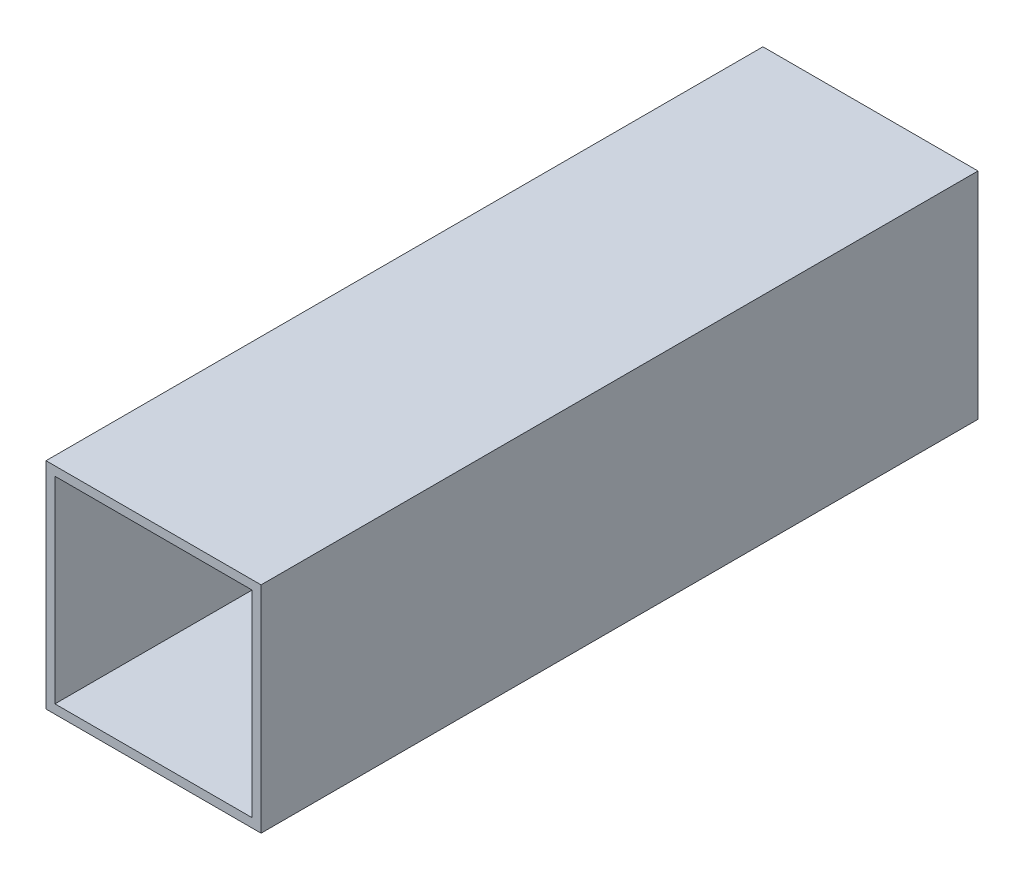
ISO-10303-21;
HEADER;
FILE_DESCRIPTION(('STEP AP214'),'2;1');
FILE_NAME('part.step','',(''),(''),'','','');
FILE_SCHEMA(('AUTOMOTIVE_DESIGN { 1 0 10303 214 1 1 1 1 }'));
ENDSEC;
DATA;
#1=APPLICATION_CONTEXT('core data for automotive mechanical design processes');
#2=APPLICATION_PROTOCOL_DEFINITION('international standard','automotive_design',2000,#1);
#3=PRODUCT_CONTEXT('',#1,'mechanical');
#4=PRODUCT('Part','Part','',(#3));
#5=PRODUCT_RELATED_PRODUCT_CATEGORY('part','',(#4));
#6=PRODUCT_DEFINITION_FORMATION('','',#4);
#7=PRODUCT_DEFINITION_CONTEXT('part definition',#1,'design');
#8=PRODUCT_DEFINITION('design','',#6,#7);
#9=PRODUCT_DEFINITION_SHAPE('','',#8);
#10=(LENGTH_UNIT() NAMED_UNIT(*) SI_UNIT(.MILLI.,.METRE.));
#11=(NAMED_UNIT(*) PLANE_ANGLE_UNIT() SI_UNIT($,.RADIAN.));
#12=(NAMED_UNIT(*) SI_UNIT($,.STERADIAN.) SOLID_ANGLE_UNIT());
#13=UNCERTAINTY_MEASURE_WITH_UNIT(LENGTH_MEASURE(1.E-05),#10,'distance_accuracy_value','');
#14=(GEOMETRIC_REPRESENTATION_CONTEXT(3) GLOBAL_UNCERTAINTY_ASSIGNED_CONTEXT((#13)) GLOBAL_UNIT_ASSIGNED_CONTEXT((#10,
#11,#12)) REPRESENTATION_CONTEXT('',''));
#15=CARTESIAN_POINT('',(0.,0.,0.));
#16=DIRECTION('',(0.,0.,1.));
#17=DIRECTION('',(1.,0.,0.));
#18=AXIS2_PLACEMENT_3D('',#15,#16,#17);
#19=CARTESIAN_POINT('',(0.,0.,127.));
#20=DIRECTION('',(0.,0.,-1.));
#21=DIRECTION('',(-1.,0.,0.));
#22=AXIS2_PLACEMENT_3D('',#19,#20,#21);
#23=PLANE('',#22);
#24=DIRECTION('',(0.,-1.,0.));
#25=VECTOR('',#24,1.);
#26=CARTESIAN_POINT('',(0.,0.,127.));
#27=LINE('',#26,#25);
#28=CARTESIAN_POINT('',(0.,38.1,127.));
#29=VERTEX_POINT('',#28);
#30=CARTESIAN_POINT('',(0.,0.,127.));
#31=VERTEX_POINT('',#30);
#32=EDGE_CURVE('E134',#29,#31,#27,.T.);
#33=ORIENTED_EDGE('',*,*,#32,.T.);
#34=DIRECTION('',(1.,0.,0.));
#35=VECTOR('',#34,1.);
#36=CARTESIAN_POINT('',(0.,0.,127.));
#37=LINE('',#36,#35);
#38=CARTESIAN_POINT('',(38.1,0.,127.));
#39=VERTEX_POINT('',#38);
#40=EDGE_CURVE('E137',#31,#39,#37,.T.);
#41=ORIENTED_EDGE('',*,*,#40,.T.);
#42=DIRECTION('',(0.,1.,0.));
#43=VECTOR('',#42,1.);
#44=CARTESIAN_POINT('',(38.1,0.,127.));
#45=LINE('',#44,#43);
#46=CARTESIAN_POINT('',(38.1,38.1,127.));
#47=VERTEX_POINT('',#46);
#48=EDGE_CURVE('E140',#39,#47,#45,.T.);
#49=ORIENTED_EDGE('',*,*,#48,.T.);
#50=DIRECTION('',(-1.,0.,0.));
#51=VECTOR('',#50,1.);
#52=CARTESIAN_POINT('',(0.,38.1,127.));
#53=LINE('',#52,#51);
#54=EDGE_CURVE('E142',#47,#29,#53,.T.);
#55=ORIENTED_EDGE('',*,*,#54,.T.);
#56=EDGE_LOOP('',(#33,#41,#49,#55));
#57=FACE_BOUND('',#56,.T.);
#58=DIRECTION('',(0.,-1.,0.));
#59=VECTOR('',#58,1.);
#60=CARTESIAN_POINT('',(1.5875,1.5875,127.));
#61=LINE('',#60,#59);
#62=CARTESIAN_POINT('',(1.5875,36.5125,127.));
#63=VERTEX_POINT('',#62);
#64=CARTESIAN_POINT('',(1.5875,1.5875,127.));
#65=VERTEX_POINT('',#64);
#66=EDGE_CURVE('E98',#63,#65,#61,.T.);
#67=ORIENTED_EDGE('',*,*,#66,.F.);
#68=DIRECTION('',(-1.,0.,0.));
#69=VECTOR('',#68,1.);
#70=CARTESIAN_POINT('',(1.5875,36.5125,127.));
#71=LINE('',#70,#69);
#72=CARTESIAN_POINT('',(36.5125,36.5125,127.));
#73=VERTEX_POINT('',#72);
#74=EDGE_CURVE('E120',#73,#63,#71,.T.);
#75=ORIENTED_EDGE('',*,*,#74,.F.);
#76=DIRECTION('',(0.,1.,0.));
#77=VECTOR('',#76,1.);
#78=CARTESIAN_POINT('',(36.5125,1.5875,127.));
#79=LINE('',#78,#77);
#80=CARTESIAN_POINT('',(36.5125,1.5875,127.));
#81=VERTEX_POINT('',#80);
#82=EDGE_CURVE('E118',#81,#73,#79,.T.);
#83=ORIENTED_EDGE('',*,*,#82,.F.);
#84=DIRECTION('',(1.,0.,0.));
#85=VECTOR('',#84,1.);
#86=CARTESIAN_POINT('',(1.5875,1.5875,127.));
#87=LINE('',#86,#85);
#88=EDGE_CURVE('E106',#65,#81,#87,.T.);
#89=ORIENTED_EDGE('',*,*,#88,.F.);
#90=EDGE_LOOP('',(#67,#75,#83,#89));
#91=FACE_BOUND('',#90,.T.);
#92=ADVANCED_FACE('F33',(#57,#91),#23,.F.);
#93=CARTESIAN_POINT('',(0.,0.,0.));
#94=DIRECTION('',(0.,0.,-1.));
#95=DIRECTION('',(-1.,0.,0.));
#96=AXIS2_PLACEMENT_3D('',#93,#94,#95);
#97=PLANE('',#96);
#98=DIRECTION('',(0.,-1.,0.));
#99=VECTOR('',#98,1.);
#100=CARTESIAN_POINT('',(0.,0.,0.));
#101=LINE('',#100,#99);
#102=CARTESIAN_POINT('',(0.,38.1,0.));
#103=VERTEX_POINT('',#102);
#104=CARTESIAN_POINT('',(0.,0.,0.));
#105=VERTEX_POINT('',#104);
#106=EDGE_CURVE('E114',#103,#105,#101,.T.);
#107=ORIENTED_EDGE('',*,*,#106,.F.);
#108=DIRECTION('',(-1.,0.,0.));
#109=VECTOR('',#108,1.);
#110=CARTESIAN_POINT('',(0.,38.1,0.));
#111=LINE('',#110,#109);
#112=CARTESIAN_POINT('',(38.1,38.1,0.));
#113=VERTEX_POINT('',#112);
#114=EDGE_CURVE('E138',#113,#103,#111,.T.);
#115=ORIENTED_EDGE('',*,*,#114,.F.);
#116=DIRECTION('',(0.,1.,0.));
#117=VECTOR('',#116,1.);
#118=CARTESIAN_POINT('',(38.1,0.,0.));
#119=LINE('',#118,#117);
#120=CARTESIAN_POINT('',(38.1,0.,0.));
#121=VERTEX_POINT('',#120);
#122=EDGE_CURVE('E149',#121,#113,#119,.T.);
#123=ORIENTED_EDGE('',*,*,#122,.F.);
#124=DIRECTION('',(1.,0.,0.));
#125=VECTOR('',#124,1.);
#126=CARTESIAN_POINT('',(0.,0.,0.));
#127=LINE('',#126,#125);
#128=EDGE_CURVE('E147',#105,#121,#127,.T.);
#129=ORIENTED_EDGE('',*,*,#128,.F.);
#130=EDGE_LOOP('',(#107,#115,#123,#129));
#131=FACE_BOUND('',#130,.T.);
#132=DIRECTION('',(-1.,0.,0.));
#133=VECTOR('',#132,1.);
#134=CARTESIAN_POINT('',(1.5875,36.5125,0.));
#135=LINE('',#134,#133);
#136=CARTESIAN_POINT('',(36.5125,36.5125,0.));
#137=VERTEX_POINT('',#136);
#138=CARTESIAN_POINT('',(1.5875,36.5125,0.));
#139=VERTEX_POINT('',#138);
#140=EDGE_CURVE('E107',#137,#139,#135,.T.);
#141=ORIENTED_EDGE('',*,*,#140,.T.);
#142=DIRECTION('',(0.,-1.,0.));
#143=VECTOR('',#142,1.);
#144=CARTESIAN_POINT('',(1.5875,1.5875,0.));
#145=LINE('',#144,#143);
#146=CARTESIAN_POINT('',(1.5875,1.5875,0.));
#147=VERTEX_POINT('',#146);
#148=EDGE_CURVE('E56',#139,#147,#145,.T.);
#149=ORIENTED_EDGE('',*,*,#148,.T.);
#150=DIRECTION('',(1.,0.,0.));
#151=VECTOR('',#150,1.);
#152=CARTESIAN_POINT('',(1.5875,1.5875,0.));
#153=LINE('',#152,#151);
#154=CARTESIAN_POINT('',(36.5125,1.5875,0.));
#155=VERTEX_POINT('',#154);
#156=EDGE_CURVE('E113',#147,#155,#153,.T.);
#157=ORIENTED_EDGE('',*,*,#156,.T.);
#158=DIRECTION('',(0.,1.,0.));
#159=VECTOR('',#158,1.);
#160=CARTESIAN_POINT('',(36.5125,1.5875,0.));
#161=LINE('',#160,#159);
#162=EDGE_CURVE('E126',#155,#137,#161,.T.);
#163=ORIENTED_EDGE('',*,*,#162,.T.);
#164=EDGE_LOOP('',(#141,#149,#157,#163));
#165=FACE_BOUND('',#164,.T.);
#166=ADVANCED_FACE('F167',(#131,#165),#97,.T.);
#167=CARTESIAN_POINT('',(0.,0.,127.));
#168=DIRECTION('',(1.,0.,0.));
#169=DIRECTION('',(0.,0.,-1.));
#170=AXIS2_PLACEMENT_3D('',#167,#168,#169);
#171=PLANE('',#170);
#172=ORIENTED_EDGE('',*,*,#106,.T.);
#173=DIRECTION('',(0.,0.,-1.));
#174=VECTOR('',#173,1.);
#175=CARTESIAN_POINT('',(0.,0.,127.));
#176=LINE('',#175,#174);
#177=EDGE_CURVE('E11',#31,#105,#176,.T.);
#178=ORIENTED_EDGE('',*,*,#177,.F.);
#179=ORIENTED_EDGE('',*,*,#32,.F.);
#180=DIRECTION('',(0.,0.,-1.));
#181=VECTOR('',#180,1.);
#182=CARTESIAN_POINT('',(0.,38.1,127.));
#183=LINE('',#182,#181);
#184=EDGE_CURVE('E144',#29,#103,#183,.T.);
#185=ORIENTED_EDGE('',*,*,#184,.T.);
#186=EDGE_LOOP('',(#172,#178,#179,#185));
#187=FACE_BOUND('',#186,.T.);
#188=ADVANCED_FACE('F35',(#187),#171,.F.);
#189=CARTESIAN_POINT('',(0.,0.,127.));
#190=DIRECTION('',(0.,1.,0.));
#191=DIRECTION('',(0.,0.,1.));
#192=AXIS2_PLACEMENT_3D('',#189,#190,#191);
#193=PLANE('',#192);
#194=ORIENTED_EDGE('',*,*,#128,.T.);
#195=DIRECTION('',(0.,0.,-1.));
#196=VECTOR('',#195,1.);
#197=CARTESIAN_POINT('',(38.1,0.,127.));
#198=LINE('',#197,#196);
#199=EDGE_CURVE('E41',#39,#121,#198,.T.);
#200=ORIENTED_EDGE('',*,*,#199,.F.);
#201=ORIENTED_EDGE('',*,*,#40,.F.);
#202=ORIENTED_EDGE('',*,*,#177,.T.);
#203=EDGE_LOOP('',(#194,#200,#201,#202));
#204=FACE_BOUND('',#203,.T.);
#205=ADVANCED_FACE('F177',(#204),#193,.F.);
#206=CARTESIAN_POINT('',(38.1,0.,127.));
#207=DIRECTION('',(-1.,0.,0.));
#208=DIRECTION('',(0.,0.,1.));
#209=AXIS2_PLACEMENT_3D('',#206,#207,#208);
#210=PLANE('',#209);
#211=ORIENTED_EDGE('',*,*,#122,.T.);
#212=DIRECTION('',(0.,0.,-1.));
#213=VECTOR('',#212,1.);
#214=CARTESIAN_POINT('',(38.1,38.1,127.));
#215=LINE('',#214,#213);
#216=EDGE_CURVE('E154',#47,#113,#215,.T.);
#217=ORIENTED_EDGE('',*,*,#216,.F.);
#218=ORIENTED_EDGE('',*,*,#48,.F.);
#219=ORIENTED_EDGE('',*,*,#199,.T.);
#220=EDGE_LOOP('',(#211,#217,#218,#219));
#221=FACE_BOUND('',#220,.T.);
#222=ADVANCED_FACE('F161',(#221),#210,.F.);
#223=CARTESIAN_POINT('',(0.,38.1,127.));
#224=DIRECTION('',(0.,-1.,0.));
#225=DIRECTION('',(0.,0.,-1.));
#226=AXIS2_PLACEMENT_3D('',#223,#224,#225);
#227=PLANE('',#226);
#228=ORIENTED_EDGE('',*,*,#114,.T.);
#229=ORIENTED_EDGE('',*,*,#184,.F.);
#230=ORIENTED_EDGE('',*,*,#54,.F.);
#231=ORIENTED_EDGE('',*,*,#216,.T.);
#232=EDGE_LOOP('',(#228,#229,#230,#231));
#233=FACE_BOUND('',#232,.T.);
#234=ADVANCED_FACE('F171',(#233),#227,.F.);
#235=CARTESIAN_POINT('',(1.5875,1.5875,127.));
#236=DIRECTION('',(1.,0.,0.));
#237=DIRECTION('',(0.,1.,0.));
#238=AXIS2_PLACEMENT_3D('',#235,#236,#237);
#239=PLANE('',#238);
#240=ORIENTED_EDGE('',*,*,#148,.F.);
#241=DIRECTION('',(0.,0.,-1.));
#242=VECTOR('',#241,1.);
#243=CARTESIAN_POINT('',(1.5875,36.5125,127.));
#244=LINE('',#243,#242);
#245=EDGE_CURVE('E102',#63,#139,#244,.T.);
#246=ORIENTED_EDGE('',*,*,#245,.F.);
#247=ORIENTED_EDGE('',*,*,#66,.T.);
#248=DIRECTION('',(0.,0.,-1.));
#249=VECTOR('',#248,1.);
#250=CARTESIAN_POINT('',(1.5875,1.5875,127.));
#251=LINE('',#250,#249);
#252=EDGE_CURVE('E101',#65,#147,#251,.T.);
#253=ORIENTED_EDGE('',*,*,#252,.T.);
#254=EDGE_LOOP('',(#240,#246,#247,#253));
#255=FACE_BOUND('',#254,.T.);
#256=ADVANCED_FACE('F100',(#255),#239,.T.);
#257=CARTESIAN_POINT('',(1.5875,1.5875,127.));
#258=DIRECTION('',(0.,1.,0.));
#259=DIRECTION('',(0.,0.,1.));
#260=AXIS2_PLACEMENT_3D('',#257,#258,#259);
#261=PLANE('',#260);
#262=ORIENTED_EDGE('',*,*,#156,.F.);
#263=ORIENTED_EDGE('',*,*,#252,.F.);
#264=ORIENTED_EDGE('',*,*,#88,.T.);
#265=DIRECTION('',(0.,0.,-1.));
#266=VECTOR('',#265,1.);
#267=CARTESIAN_POINT('',(36.5125,1.5875,127.));
#268=LINE('',#267,#266);
#269=EDGE_CURVE('E115',#81,#155,#268,.T.);
#270=ORIENTED_EDGE('',*,*,#269,.T.);
#271=EDGE_LOOP('',(#262,#263,#264,#270));
#272=FACE_BOUND('',#271,.T.);
#273=ADVANCED_FACE('F110',(#272),#261,.T.);
#274=CARTESIAN_POINT('',(36.5125,1.5875,127.));
#275=DIRECTION('',(-1.,0.,0.));
#276=DIRECTION('',(0.,0.,1.));
#277=AXIS2_PLACEMENT_3D('',#274,#275,#276);
#278=PLANE('',#277);
#279=ORIENTED_EDGE('',*,*,#162,.F.);
#280=ORIENTED_EDGE('',*,*,#269,.F.);
#281=ORIENTED_EDGE('',*,*,#82,.T.);
#282=DIRECTION('',(0.,0.,-1.));
#283=VECTOR('',#282,1.);
#284=CARTESIAN_POINT('',(36.5125,36.5125,127.));
#285=LINE('',#284,#283);
#286=EDGE_CURVE('E48',#73,#137,#285,.T.);
#287=ORIENTED_EDGE('',*,*,#286,.T.);
#288=EDGE_LOOP('',(#279,#280,#281,#287));
#289=FACE_BOUND('',#288,.T.);
#290=ADVANCED_FACE('F200',(#289),#278,.T.);
#291=CARTESIAN_POINT('',(1.5875,36.5125,127.));
#292=DIRECTION('',(0.,-1.,0.));
#293=DIRECTION('',(0.,0.,-1.));
#294=AXIS2_PLACEMENT_3D('',#291,#292,#293);
#295=PLANE('',#294);
#296=ORIENTED_EDGE('',*,*,#140,.F.);
#297=ORIENTED_EDGE('',*,*,#286,.F.);
#298=ORIENTED_EDGE('',*,*,#74,.T.);
#299=ORIENTED_EDGE('',*,*,#245,.T.);
#300=EDGE_LOOP('',(#296,#297,#298,#299));
#301=FACE_BOUND('',#300,.T.);
#302=ADVANCED_FACE('F204',(#301),#295,.T.);
#303=CLOSED_SHELL('',(#92,#166,#188,#205,#222,#234,#256,#273,#290,#302));
#304=MANIFOLD_SOLID_BREP('B2',#303);
#305=ADVANCED_BREP_SHAPE_REPRESENTATION('',(#18,#304),#14);
#306=SHAPE_DEFINITION_REPRESENTATION(#9,#305);
ENDSEC;
END-ISO-10303-21;
